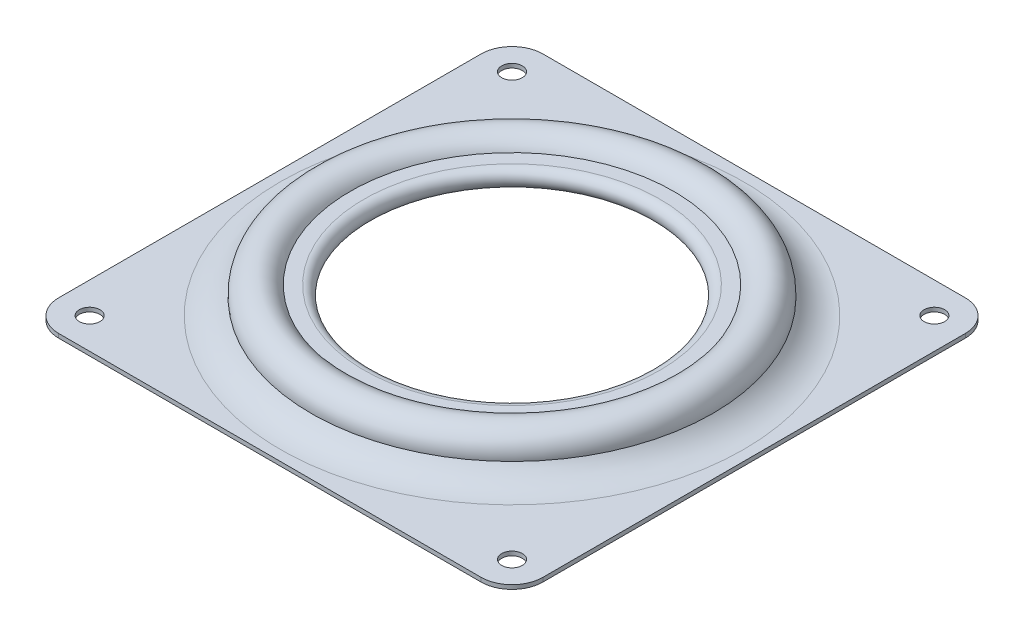
ISO-10303-21;
HEADER;
FILE_DESCRIPTION(('STEP AP214'),'2;1');
FILE_NAME('part.step','',(''),(''),'','','');
FILE_SCHEMA(('AUTOMOTIVE_DESIGN { 1 0 10303 214 1 1 1 1 }'));
ENDSEC;
DATA;
#1=APPLICATION_CONTEXT('core data for automotive mechanical design processes');
#2=APPLICATION_PROTOCOL_DEFINITION('international standard','automotive_design',2000,#1);
#3=PRODUCT_CONTEXT('',#1,'mechanical');
#4=PRODUCT('Part','Part','',(#3));
#5=PRODUCT_RELATED_PRODUCT_CATEGORY('part','',(#4));
#6=PRODUCT_DEFINITION_FORMATION('','',#4);
#7=PRODUCT_DEFINITION_CONTEXT('part definition',#1,'design');
#8=PRODUCT_DEFINITION('design','',#6,#7);
#9=PRODUCT_DEFINITION_SHAPE('','',#8);
#10=(LENGTH_UNIT() NAMED_UNIT(*) SI_UNIT(.MILLI.,.METRE.));
#11=(NAMED_UNIT(*) PLANE_ANGLE_UNIT() SI_UNIT($,.RADIAN.));
#12=(NAMED_UNIT(*) SI_UNIT($,.STERADIAN.) SOLID_ANGLE_UNIT());
#13=UNCERTAINTY_MEASURE_WITH_UNIT(LENGTH_MEASURE(1.E-05),#10,'distance_accuracy_value','');
#14=(GEOMETRIC_REPRESENTATION_CONTEXT(3) GLOBAL_UNCERTAINTY_ASSIGNED_CONTEXT((#13)) GLOBAL_UNIT_ASSIGNED_CONTEXT((#10,
#11,#12)) REPRESENTATION_CONTEXT('',''));
#15=CARTESIAN_POINT('',(0.,0.,0.));
#16=DIRECTION('',(0.,0.,1.));
#17=DIRECTION('',(1.,0.,0.));
#18=AXIS2_PLACEMENT_3D('',#15,#16,#17);
#19=CARTESIAN_POINT('',(-65.,0.,0.));
#20=DIRECTION('',(0.,1.,0.));
#21=DIRECTION('',(-1.,0.,0.));
#22=AXIS2_PLACEMENT_3D('',#19,#20,#21);
#23=PLANE('',#22);
#24=DIRECTION('',(1.,0.,0.));
#25=VECTOR('',#24,1.);
#26=CARTESIAN_POINT('',(-40.9999999999999,0.,47.));
#27=LINE('',#26,#25);
#28=CARTESIAN_POINT('',(-40.9999999999999,0.,47.));
#29=VERTEX_POINT('',#28);
#30=CARTESIAN_POINT('',(40.9999999999999,0.,47.));
#31=VERTEX_POINT('',#30);
#32=EDGE_CURVE('E103',#29,#31,#27,.T.);
#33=ORIENTED_EDGE('',*,*,#32,.F.);
#34=CARTESIAN_POINT('',(-40.9999999999998,0.,40.9999999999999));
#35=DIRECTION('',(0.,1.,0.));
#36=DIRECTION('',(0.,0.,1.));
#37=AXIS2_PLACEMENT_3D('',#34,#35,#36);
#38=CIRCLE('',#37,6.00000000000013);
#39=CARTESIAN_POINT('',(-46.9999999999999,0.,40.9999999999999));
#40=VERTEX_POINT('',#39);
#41=EDGE_CURVE('E111',#40,#29,#38,.T.);
#42=ORIENTED_EDGE('',*,*,#41,.F.);
#43=DIRECTION('',(0.,0.,1.));
#44=VECTOR('',#43,1.);
#45=CARTESIAN_POINT('',(-46.9999999999999,0.,40.9999999999999));
#46=LINE('',#45,#44);
#47=CARTESIAN_POINT('',(-47.,0.,-40.9999999999999));
#48=VERTEX_POINT('',#47);
#49=EDGE_CURVE('E133',#48,#40,#46,.T.);
#50=ORIENTED_EDGE('',*,*,#49,.F.);
#51=CARTESIAN_POINT('',(-40.9999999999999,0.,-40.9999999999999));
#52=DIRECTION('',(0.,1.,0.));
#53=DIRECTION('',(0.,0.,-1.));
#54=AXIS2_PLACEMENT_3D('',#51,#52,#53);
#55=CIRCLE('',#54,6.00000000000009);
#56=CARTESIAN_POINT('',(-40.9999999999999,0.,-47.));
#57=VERTEX_POINT('',#56);
#58=EDGE_CURVE('E47',#57,#48,#55,.T.);
#59=ORIENTED_EDGE('',*,*,#58,.F.);
#60=DIRECTION('',(-1.,0.,0.));
#61=VECTOR('',#60,1.);
#62=CARTESIAN_POINT('',(-40.9999999999999,0.,-47.));
#63=LINE('',#62,#61);
#64=CARTESIAN_POINT('',(40.9999999999999,0.,-47.));
#65=VERTEX_POINT('',#64);
#66=EDGE_CURVE('E129',#65,#57,#63,.T.);
#67=ORIENTED_EDGE('',*,*,#66,.F.);
#68=CARTESIAN_POINT('',(40.9999999999999,0.,-40.9999999999999));
#69=DIRECTION('',(0.,1.,0.));
#70=DIRECTION('',(0.,0.,1.));
#71=AXIS2_PLACEMENT_3D('',#68,#69,#70);
#72=CIRCLE('',#71,6.00000000000009);
#73=CARTESIAN_POINT('',(47.,0.,-40.9999999999999));
#74=VERTEX_POINT('',#73);
#75=EDGE_CURVE('E126',#74,#65,#72,.T.);
#76=ORIENTED_EDGE('',*,*,#75,.F.);
#77=DIRECTION('',(0.,0.,-1.));
#78=VECTOR('',#77,1.);
#79=CARTESIAN_POINT('',(46.9999999999999,0.,40.9999999999998));
#80=LINE('',#79,#78);
#81=CARTESIAN_POINT('',(46.9999999999999,0.,40.9999999999998));
#82=VERTEX_POINT('',#81);
#83=EDGE_CURVE('E121',#82,#74,#80,.T.);
#84=ORIENTED_EDGE('',*,*,#83,.F.);
#85=CARTESIAN_POINT('',(40.9999999999998,0.,40.9999999999999));
#86=DIRECTION('',(0.,1.,0.));
#87=DIRECTION('',(0.,0.,-1.));
#88=AXIS2_PLACEMENT_3D('',#85,#86,#87);
#89=CIRCLE('',#88,6.00000000000013);
#90=EDGE_CURVE('E119',#31,#82,#89,.T.);
#91=ORIENTED_EDGE('',*,*,#90,.F.);
#92=EDGE_LOOP('',(#33,#42,#50,#59,#67,#76,#84,#91));
#93=FACE_BOUND('',#92,.T.);
#94=CARTESIAN_POINT('',(41.,0.,41.));
#95=DIRECTION('',(0.,1.,0.));
#96=DIRECTION('',(0.,0.,1.));
#97=AXIS2_PLACEMENT_3D('',#94,#95,#96);
#98=CIRCLE('',#97,2.);
#99=CARTESIAN_POINT('',(41.,0.,43.));
#100=VERTEX_POINT('',#99);
#101=EDGE_CURVE('E150',#100,#100,#98,.T.);
#102=ORIENTED_EDGE('',*,*,#101,.T.);
#103=EDGE_LOOP('',(#102));
#104=FACE_BOUND('',#103,.T.);
#105=CARTESIAN_POINT('',(-40.9999999999999,0.,-41.));
#106=DIRECTION('',(0.,1.,0.));
#107=DIRECTION('',(0.,0.,1.));
#108=AXIS2_PLACEMENT_3D('',#105,#106,#107);
#109=CIRCLE('',#108,2.);
#110=CARTESIAN_POINT('',(-40.9999999999999,0.,-39.));
#111=VERTEX_POINT('',#110);
#112=EDGE_CURVE('E158',#111,#111,#109,.T.);
#113=ORIENTED_EDGE('',*,*,#112,.T.);
#114=EDGE_LOOP('',(#113));
#115=FACE_BOUND('',#114,.T.);
#116=CARTESIAN_POINT('',(0.,0.,0.));
#117=DIRECTION('',(0.,-1.,0.));
#118=DIRECTION('',(1.,0.,0.));
#119=AXIS2_PLACEMENT_3D('',#116,#117,#118);
#120=CIRCLE('',#119,45.);
#121=CARTESIAN_POINT('',(45.,0.,0.));
#122=VERTEX_POINT('',#121);
#123=EDGE_CURVE('E183',#122,#122,#120,.T.);
#124=ORIENTED_EDGE('',*,*,#123,.F.);
#125=EDGE_LOOP('',(#124));
#126=FACE_BOUND('',#125,.T.);
#127=CARTESIAN_POINT('',(-40.9999999999999,0.,41.));
#128=DIRECTION('',(0.,1.,0.));
#129=DIRECTION('',(0.,0.,-1.));
#130=AXIS2_PLACEMENT_3D('',#127,#128,#129);
#131=CIRCLE('',#130,2.);
#132=CARTESIAN_POINT('',(-40.9999999999999,0.,39.));
#133=VERTEX_POINT('',#132);
#134=EDGE_CURVE('E154',#133,#133,#131,.T.);
#135=ORIENTED_EDGE('',*,*,#134,.T.);
#136=EDGE_LOOP('',(#135));
#137=FACE_BOUND('',#136,.T.);
#138=CARTESIAN_POINT('',(41.,0.,-41.));
#139=DIRECTION('',(0.,1.,0.));
#140=DIRECTION('',(0.,0.,-1.));
#141=AXIS2_PLACEMENT_3D('',#138,#139,#140);
#142=CIRCLE('',#141,2.);
#143=CARTESIAN_POINT('',(41.,0.,-43.));
#144=VERTEX_POINT('',#143);
#145=EDGE_CURVE('E107',#144,#144,#142,.T.);
#146=ORIENTED_EDGE('',*,*,#145,.T.);
#147=EDGE_LOOP('',(#146));
#148=FACE_BOUND('',#147,.T.);
#149=ADVANCED_FACE('F33',(#93,#104,#115,#126,#137,#148),#23,.F.);
#150=CARTESIAN_POINT('',(-65.,0.800000000000001,0.));
#151=DIRECTION('',(0.,-1.,0.));
#152=DIRECTION('',(1.,0.,0.));
#153=AXIS2_PLACEMENT_3D('',#150,#151,#152);
#154=PLANE('',#153);
#155=DIRECTION('',(0.,0.,1.));
#156=VECTOR('',#155,1.);
#157=CARTESIAN_POINT('',(-46.9999999999999,0.800000000000001,0.));
#158=LINE('',#157,#156);
#159=CARTESIAN_POINT('',(-47.,0.8,-40.9999999999999));
#160=VERTEX_POINT('',#159);
#161=CARTESIAN_POINT('',(-46.9999999999999,0.800000000000001,40.9999999999999));
#162=VERTEX_POINT('',#161);
#163=EDGE_CURVE('E186',#160,#162,#158,.T.);
#164=ORIENTED_EDGE('',*,*,#163,.T.);
#165=CARTESIAN_POINT('',(-40.9999999999998,0.8,40.9999999999999));
#166=DIRECTION('',(0.,-1.,0.));
#167=DIRECTION('',(1.,0.,0.));
#168=AXIS2_PLACEMENT_3D('',#165,#166,#167);
#169=CIRCLE('',#168,6.00000000000013);
#170=CARTESIAN_POINT('',(-40.9999999999999,0.8,47.));
#171=VERTEX_POINT('',#170);
#172=EDGE_CURVE('E12',#162,#171,#169,.F.);
#173=ORIENTED_EDGE('',*,*,#172,.T.);
#174=DIRECTION('',(1.,0.,0.));
#175=VECTOR('',#174,1.);
#176=CARTESIAN_POINT('',(-65.,0.800000000000001,47.));
#177=LINE('',#176,#175);
#178=CARTESIAN_POINT('',(40.9999999999999,0.8,47.));
#179=VERTEX_POINT('',#178);
#180=EDGE_CURVE('E40',#171,#179,#177,.T.);
#181=ORIENTED_EDGE('',*,*,#180,.T.);
#182=CARTESIAN_POINT('',(40.9999999999998,0.8,40.9999999999999));
#183=DIRECTION('',(0.,-1.,0.));
#184=DIRECTION('',(1.,0.,0.));
#185=AXIS2_PLACEMENT_3D('',#182,#183,#184);
#186=CIRCLE('',#185,6.00000000000013);
#187=CARTESIAN_POINT('',(46.9999999999999,0.8,40.9999999999998));
#188=VERTEX_POINT('',#187);
#189=EDGE_CURVE('E209',#179,#188,#186,.F.);
#190=ORIENTED_EDGE('',*,*,#189,.T.);
#191=DIRECTION('',(0.,0.,-1.));
#192=VECTOR('',#191,1.);
#193=CARTESIAN_POINT('',(46.9999999999999,0.800000000000001,0.));
#194=LINE('',#193,#192);
#195=CARTESIAN_POINT('',(47.,0.8,-40.9999999999999));
#196=VERTEX_POINT('',#195);
#197=EDGE_CURVE('E206',#188,#196,#194,.T.);
#198=ORIENTED_EDGE('',*,*,#197,.T.);
#199=CARTESIAN_POINT('',(40.9999999999999,0.8,-40.9999999999999));
#200=DIRECTION('',(0.,-1.,0.));
#201=DIRECTION('',(1.,0.,0.));
#202=AXIS2_PLACEMENT_3D('',#199,#200,#201);
#203=CIRCLE('',#202,6.00000000000009);
#204=CARTESIAN_POINT('',(40.9999999999999,0.8,-47.));
#205=VERTEX_POINT('',#204);
#206=EDGE_CURVE('E203',#196,#205,#203,.F.);
#207=ORIENTED_EDGE('',*,*,#206,.T.);
#208=DIRECTION('',(-1.,0.,0.));
#209=VECTOR('',#208,1.);
#210=CARTESIAN_POINT('',(-65.,0.800000000000001,-47.));
#211=LINE('',#210,#209);
#212=CARTESIAN_POINT('',(-40.9999999999999,0.8,-47.));
#213=VERTEX_POINT('',#212);
#214=EDGE_CURVE('E200',#205,#213,#211,.T.);
#215=ORIENTED_EDGE('',*,*,#214,.T.);
#216=CARTESIAN_POINT('',(-40.9999999999999,0.8,-40.9999999999999));
#217=DIRECTION('',(0.,-1.,0.));
#218=DIRECTION('',(1.,0.,0.));
#219=AXIS2_PLACEMENT_3D('',#216,#217,#218);
#220=CIRCLE('',#219,6.00000000000009);
#221=EDGE_CURVE('E197',#213,#160,#220,.F.);
#222=ORIENTED_EDGE('',*,*,#221,.T.);
#223=EDGE_LOOP('',(#164,#173,#181,#190,#198,#207,#215,#222));
#224=FACE_BOUND('',#223,.T.);
#225=CARTESIAN_POINT('',(41.,0.8,41.));
#226=DIRECTION('',(0.,-1.,0.));
#227=DIRECTION('',(1.,0.,0.));
#228=AXIS2_PLACEMENT_3D('',#225,#226,#227);
#229=CIRCLE('',#228,2.);
#230=CARTESIAN_POINT('',(43.,0.8,41.));
#231=VERTEX_POINT('',#230);
#232=EDGE_CURVE('E153',#231,#231,#229,.F.);
#233=ORIENTED_EDGE('',*,*,#232,.F.);
#234=EDGE_LOOP('',(#233));
#235=FACE_BOUND('',#234,.T.);
#236=CARTESIAN_POINT('',(-40.9999999999999,0.8,-41.));
#237=DIRECTION('',(0.,-1.,0.));
#238=DIRECTION('',(1.,0.,0.));
#239=AXIS2_PLACEMENT_3D('',#236,#237,#238);
#240=CIRCLE('',#239,2.);
#241=CARTESIAN_POINT('',(-38.9999999999999,0.8,-41.));
#242=VERTEX_POINT('',#241);
#243=EDGE_CURVE('E161',#242,#242,#240,.F.);
#244=ORIENTED_EDGE('',*,*,#243,.F.);
#245=EDGE_LOOP('',(#244));
#246=FACE_BOUND('',#245,.T.);
#247=CARTESIAN_POINT('',(0.,0.800000000000002,0.));
#248=DIRECTION('',(0.,-1.,0.));
#249=DIRECTION('',(1.,0.,0.));
#250=AXIS2_PLACEMENT_3D('',#247,#248,#249);
#251=CIRCLE('',#250,45.);
#252=CARTESIAN_POINT('',(45.,0.800000000000002,0.));
#253=VERTEX_POINT('',#252);
#254=EDGE_CURVE('E162',#253,#253,#251,.T.);
#255=ORIENTED_EDGE('',*,*,#254,.T.);
#256=EDGE_LOOP('',(#255));
#257=FACE_BOUND('',#256,.T.);
#258=CARTESIAN_POINT('',(-40.9999999999999,0.8,41.));
#259=DIRECTION('',(0.,-1.,0.));
#260=DIRECTION('',(1.,0.,0.));
#261=AXIS2_PLACEMENT_3D('',#258,#259,#260);
#262=CIRCLE('',#261,2.);
#263=CARTESIAN_POINT('',(-38.9999999999999,0.8,41.));
#264=VERTEX_POINT('',#263);
#265=EDGE_CURVE('E157',#264,#264,#262,.F.);
#266=ORIENTED_EDGE('',*,*,#265,.F.);
#267=EDGE_LOOP('',(#266));
#268=FACE_BOUND('',#267,.T.);
#269=CARTESIAN_POINT('',(41.,0.8,-41.));
#270=DIRECTION('',(0.,-1.,0.));
#271=DIRECTION('',(1.,0.,0.));
#272=AXIS2_PLACEMENT_3D('',#269,#270,#271);
#273=CIRCLE('',#272,2.);
#274=CARTESIAN_POINT('',(43.,0.8,-41.));
#275=VERTEX_POINT('',#274);
#276=EDGE_CURVE('E149',#275,#275,#273,.F.);
#277=ORIENTED_EDGE('',*,*,#276,.F.);
#278=EDGE_LOOP('',(#277));
#279=FACE_BOUND('',#278,.T.);
#280=ADVANCED_FACE('F212',(#224,#235,#246,#257,#268,#279),#154,.F.);
#281=CARTESIAN_POINT('',(0.,15.,0.));
#282=DIRECTION('',(0.,-1.,0.));
#283=DIRECTION('',(1.,0.,0.));
#284=AXIS2_PLACEMENT_3D('',#281,#282,#283);
#285=TOROIDAL_SURFACE('',#284,45.,15.);
#286=CARTESIAN_POINT('',(0.,1.69347428902901,0.));
#287=DIRECTION('',(0.,-1.,0.));
#288=DIRECTION('',(1.,0.,0.));
#289=AXIS2_PLACEMENT_3D('',#286,#287,#288);
#290=CIRCLE('',#289,38.0763901392938);
#291=CARTESIAN_POINT('',(38.0763901392938,1.69347428902901,0.));
#292=VERTEX_POINT('',#291);
#293=EDGE_CURVE('E180',#292,#292,#290,.T.);
#294=ORIENTED_EDGE('',*,*,#293,.F.);
#295=EDGE_LOOP('',(#294));
#296=FACE_BOUND('',#295,.T.);
#297=ORIENTED_EDGE('',*,*,#123,.T.);
#298=EDGE_LOOP('',(#297));
#299=FACE_BOUND('',#298,.T.);
#300=ADVANCED_FACE('F242',(#296,#299),#285,.T.);
#301=CARTESIAN_POINT('',(0.,4.25,0.));
#302=DIRECTION('',(0.,-1.,0.));
#303=DIRECTION('',(1.,0.,0.));
#304=AXIS2_PLACEMENT_3D('',#301,#302,#303);
#305=TOROIDAL_SURFACE('',#304,35.,4.);
#306=CARTESIAN_POINT('',(0.,2.5,0.));
#307=DIRECTION('',(0.,-1.,0.));
#308=DIRECTION('',(1.,0.,0.));
#309=AXIS2_PLACEMENT_3D('',#306,#307,#308);
#310=CIRCLE('',#309,31.4031263575155);
#311=CARTESIAN_POINT('',(31.4031263575155,2.5,0.));
#312=VERTEX_POINT('',#311);
#313=EDGE_CURVE('E177',#312,#312,#310,.T.);
#314=ORIENTED_EDGE('',*,*,#313,.F.);
#315=EDGE_LOOP('',(#314));
#316=FACE_BOUND('',#315,.T.);
#317=ORIENTED_EDGE('',*,*,#293,.T.);
#318=EDGE_LOOP('',(#317));
#319=FACE_BOUND('',#318,.T.);
#320=ADVANCED_FACE('F247',(#316,#319),#305,.T.);
#321=CARTESIAN_POINT('',(-31.4031263575155,2.5,0.));
#322=DIRECTION('',(0.,1.,0.));
#323=DIRECTION('',(-1.,0.,0.));
#324=AXIS2_PLACEMENT_3D('',#321,#322,#323);
#325=PLANE('',#324);
#326=CARTESIAN_POINT('',(0.,2.5,0.));
#327=DIRECTION('',(0.,-1.,0.));
#328=DIRECTION('',(1.,0.,0.));
#329=AXIS2_PLACEMENT_3D('',#326,#327,#328);
#330=CIRCLE('',#329,28.75);
#331=CARTESIAN_POINT('',(28.75,2.5,0.));
#332=VERTEX_POINT('',#331);
#333=EDGE_CURVE('E174',#332,#332,#330,.T.);
#334=ORIENTED_EDGE('',*,*,#333,.F.);
#335=EDGE_LOOP('',(#334));
#336=FACE_BOUND('',#335,.T.);
#337=ORIENTED_EDGE('',*,*,#313,.T.);
#338=EDGE_LOOP('',(#337));
#339=FACE_BOUND('',#338,.T.);
#340=ADVANCED_FACE('F268',(#336,#339),#325,.F.);
#341=CARTESIAN_POINT('',(0.,4.25,0.));
#342=DIRECTION('',(0.,-1.,0.));
#343=DIRECTION('',(1.,0.,0.));
#344=AXIS2_PLACEMENT_3D('',#341,#342,#343);
#345=TOROIDAL_SURFACE('',#344,28.75,1.75);
#346=CARTESIAN_POINT('',(0.,6.,0.));
#347=DIRECTION('',(0.,-1.,0.));
#348=DIRECTION('',(1.,0.,0.));
#349=AXIS2_PLACEMENT_3D('',#346,#347,#348);
#350=CIRCLE('',#349,28.75);
#351=CARTESIAN_POINT('',(28.75,6.,0.));
#352=VERTEX_POINT('',#351);
#353=EDGE_CURVE('E171',#352,#352,#350,.T.);
#354=ORIENTED_EDGE('',*,*,#353,.F.);
#355=EDGE_LOOP('',(#354));
#356=FACE_BOUND('',#355,.T.);
#357=ORIENTED_EDGE('',*,*,#333,.T.);
#358=EDGE_LOOP('',(#357));
#359=FACE_BOUND('',#358,.T.);
#360=ADVANCED_FACE('F264',(#356,#359),#345,.T.);
#361=CARTESIAN_POINT('',(-28.75,6.,0.));
#362=DIRECTION('',(0.,-1.,0.));
#363=DIRECTION('',(1.,0.,0.));
#364=AXIS2_PLACEMENT_3D('',#361,#362,#363);
#365=PLANE('',#364);
#366=CARTESIAN_POINT('',(0.,6.,0.));
#367=DIRECTION('',(0.,-1.,0.));
#368=DIRECTION('',(1.,0.,0.));
#369=AXIS2_PLACEMENT_3D('',#366,#367,#368);
#370=CIRCLE('',#369,31.4031263575155);
#371=CARTESIAN_POINT('',(31.4031263575155,6.,0.));
#372=VERTEX_POINT('',#371);
#373=EDGE_CURVE('E168',#372,#372,#370,.T.);
#374=ORIENTED_EDGE('',*,*,#373,.F.);
#375=EDGE_LOOP('',(#374));
#376=FACE_BOUND('',#375,.T.);
#377=ORIENTED_EDGE('',*,*,#353,.T.);
#378=EDGE_LOOP('',(#377));
#379=FACE_BOUND('',#378,.T.);
#380=ADVANCED_FACE('F260',(#376,#379),#365,.F.);
#381=CARTESIAN_POINT('',(0.,4.25,0.));
#382=DIRECTION('',(0.,-1.,0.));
#383=DIRECTION('',(1.,0.,0.));
#384=AXIS2_PLACEMENT_3D('',#381,#382,#383);
#385=TOROIDAL_SURFACE('',#384,35.,4.);
#386=CARTESIAN_POINT('',(0.,3.82967904525176,0.));
#387=DIRECTION('',(0.,-1.,0.));
#388=DIRECTION('',(1.,0.,0.));
#389=AXIS2_PLACEMENT_3D('',#386,#387,#388);
#390=CIRCLE('',#389,38.977854986673);
#391=CARTESIAN_POINT('',(38.977854986673,3.82967904525176,0.));
#392=VERTEX_POINT('',#391);
#393=EDGE_CURVE('E165',#392,#392,#390,.T.);
#394=ORIENTED_EDGE('',*,*,#393,.F.);
#395=EDGE_LOOP('',(#394));
#396=FACE_BOUND('',#395,.T.);
#397=ORIENTED_EDGE('',*,*,#373,.T.);
#398=EDGE_LOOP('',(#397));
#399=FACE_BOUND('',#398,.T.);
#400=ADVANCED_FACE('F256',(#396,#399),#385,.T.);
#401=CARTESIAN_POINT('',(0.,8.3,0.));
#402=DIRECTION('',(0.,-1.,0.));
#403=DIRECTION('',(1.,0.,0.));
#404=AXIS2_PLACEMENT_3D('',#401,#402,#403);
#405=TOROIDAL_SURFACE('',#404,45.,7.5);
#406=ORIENTED_EDGE('',*,*,#254,.F.);
#407=EDGE_LOOP('',(#406));
#408=FACE_BOUND('',#407,.T.);
#409=ORIENTED_EDGE('',*,*,#393,.T.);
#410=EDGE_LOOP('',(#409));
#411=FACE_BOUND('',#410,.T.);
#412=ADVANCED_FACE('F253',(#408,#411),#405,.F.);
#413=CARTESIAN_POINT('',(-40.9999999999999,10.,-41.));
#414=DIRECTION('',(0.,-1.,0.));
#415=DIRECTION('',(0.,0.,-1.));
#416=AXIS2_PLACEMENT_3D('',#413,#414,#415);
#417=CYLINDRICAL_SURFACE('',#416,2.);
#418=ORIENTED_EDGE('',*,*,#112,.F.);
#419=EDGE_LOOP('',(#418));
#420=FACE_BOUND('',#419,.T.);
#421=ORIENTED_EDGE('',*,*,#243,.T.);
#422=EDGE_LOOP('',(#421));
#423=FACE_BOUND('',#422,.T.);
#424=ADVANCED_FACE('F251',(#420,#423),#417,.F.);
#425=CARTESIAN_POINT('',(-40.9999999999999,10.,41.));
#426=DIRECTION('',(0.,-1.,0.));
#427=DIRECTION('',(0.,0.,-1.));
#428=AXIS2_PLACEMENT_3D('',#425,#426,#427);
#429=CYLINDRICAL_SURFACE('',#428,2.);
#430=ORIENTED_EDGE('',*,*,#134,.F.);
#431=EDGE_LOOP('',(#430));
#432=FACE_BOUND('',#431,.T.);
#433=ORIENTED_EDGE('',*,*,#265,.T.);
#434=EDGE_LOOP('',(#433));
#435=FACE_BOUND('',#434,.T.);
#436=ADVANCED_FACE('F300',(#432,#435),#429,.F.);
#437=CARTESIAN_POINT('',(41.,10.,41.));
#438=DIRECTION('',(0.,-1.,0.));
#439=DIRECTION('',(0.,0.,-1.));
#440=AXIS2_PLACEMENT_3D('',#437,#438,#439);
#441=CYLINDRICAL_SURFACE('',#440,2.);
#442=ORIENTED_EDGE('',*,*,#101,.F.);
#443=EDGE_LOOP('',(#442));
#444=FACE_BOUND('',#443,.T.);
#445=ORIENTED_EDGE('',*,*,#232,.T.);
#446=EDGE_LOOP('',(#445));
#447=FACE_BOUND('',#446,.T.);
#448=ADVANCED_FACE('F291',(#444,#447),#441,.F.);
#449=CARTESIAN_POINT('',(41.,10.,-41.));
#450=DIRECTION('',(0.,-1.,0.));
#451=DIRECTION('',(0.,0.,-1.));
#452=AXIS2_PLACEMENT_3D('',#449,#450,#451);
#453=CYLINDRICAL_SURFACE('',#452,2.);
#454=ORIENTED_EDGE('',*,*,#145,.F.);
#455=EDGE_LOOP('',(#454));
#456=FACE_BOUND('',#455,.T.);
#457=ORIENTED_EDGE('',*,*,#276,.T.);
#458=EDGE_LOOP('',(#457));
#459=FACE_BOUND('',#458,.T.);
#460=ADVANCED_FACE('F288',(#456,#459),#453,.F.);
#461=CARTESIAN_POINT('',(-40.9999999999998,10.,40.9999999999999));
#462=DIRECTION('',(0.,-1.,0.));
#463=DIRECTION('',(0.,0.,-1.));
#464=AXIS2_PLACEMENT_3D('',#461,#462,#463);
#465=CYLINDRICAL_SURFACE('',#464,6.00000000000013);
#466=DIRECTION('',(0.,-1.,0.));
#467=VECTOR('',#466,1.);
#468=CARTESIAN_POINT('',(-46.9999999999999,10.,40.9999999999999));
#469=LINE('',#468,#467);
#470=EDGE_CURVE('E55',#162,#40,#469,.T.);
#471=ORIENTED_EDGE('',*,*,#470,.T.);
#472=ORIENTED_EDGE('',*,*,#41,.T.);
#473=DIRECTION('',(0.,-1.,0.));
#474=VECTOR('',#473,1.);
#475=CARTESIAN_POINT('',(-40.9999999999999,10.,47.));
#476=LINE('',#475,#474);
#477=EDGE_CURVE('E98',#171,#29,#476,.T.);
#478=ORIENTED_EDGE('',*,*,#477,.F.);
#479=ORIENTED_EDGE('',*,*,#172,.F.);
#480=EDGE_LOOP('',(#471,#472,#478,#479));
#481=FACE_BOUND('',#480,.T.);
#482=ADVANCED_FACE('F112',(#481),#465,.T.);
#483=CARTESIAN_POINT('',(-40.9999999999999,10.,47.));
#484=DIRECTION('',(0.,0.,-1.));
#485=DIRECTION('',(-1.,0.,0.));
#486=AXIS2_PLACEMENT_3D('',#483,#484,#485);
#487=PLANE('',#486);
#488=ORIENTED_EDGE('',*,*,#477,.T.);
#489=ORIENTED_EDGE('',*,*,#32,.T.);
#490=DIRECTION('',(0.,-1.,0.));
#491=VECTOR('',#490,1.);
#492=CARTESIAN_POINT('',(40.9999999999999,10.,47.));
#493=LINE('',#492,#491);
#494=EDGE_CURVE('E108',#179,#31,#493,.T.);
#495=ORIENTED_EDGE('',*,*,#494,.F.);
#496=ORIENTED_EDGE('',*,*,#180,.F.);
#497=EDGE_LOOP('',(#488,#489,#495,#496));
#498=FACE_BOUND('',#497,.T.);
#499=ADVANCED_FACE('F100',(#498),#487,.F.);
#500=CARTESIAN_POINT('',(40.9999999999998,10.,40.9999999999999));
#501=DIRECTION('',(0.,-1.,0.));
#502=DIRECTION('',(0.,0.,-1.));
#503=AXIS2_PLACEMENT_3D('',#500,#501,#502);
#504=CYLINDRICAL_SURFACE('',#503,6.00000000000013);
#505=ORIENTED_EDGE('',*,*,#494,.T.);
#506=ORIENTED_EDGE('',*,*,#90,.T.);
#507=DIRECTION('',(0.,-1.,0.));
#508=VECTOR('',#507,1.);
#509=CARTESIAN_POINT('',(46.9999999999999,10.,40.9999999999998));
#510=LINE('',#509,#508);
#511=EDGE_CURVE('E144',#188,#82,#510,.T.);
#512=ORIENTED_EDGE('',*,*,#511,.F.);
#513=ORIENTED_EDGE('',*,*,#189,.F.);
#514=EDGE_LOOP('',(#505,#506,#512,#513));
#515=FACE_BOUND('',#514,.T.);
#516=ADVANCED_FACE('F229',(#515),#504,.T.);
#517=CARTESIAN_POINT('',(46.9999999999999,10.,40.9999999999998));
#518=DIRECTION('',(-1.,0.,0.));
#519=DIRECTION('',(0.,0.,1.));
#520=AXIS2_PLACEMENT_3D('',#517,#518,#519);
#521=PLANE('',#520);
#522=ORIENTED_EDGE('',*,*,#511,.T.);
#523=ORIENTED_EDGE('',*,*,#83,.T.);
#524=DIRECTION('',(0.,-1.,0.));
#525=VECTOR('',#524,1.);
#526=CARTESIAN_POINT('',(47.,10.,-40.9999999999999));
#527=LINE('',#526,#525);
#528=EDGE_CURVE('E142',#196,#74,#527,.T.);
#529=ORIENTED_EDGE('',*,*,#528,.F.);
#530=ORIENTED_EDGE('',*,*,#197,.F.);
#531=EDGE_LOOP('',(#522,#523,#529,#530));
#532=FACE_BOUND('',#531,.T.);
#533=ADVANCED_FACE('F225',(#532),#521,.F.);
#534=CARTESIAN_POINT('',(40.9999999999999,10.,-40.9999999999999));
#535=DIRECTION('',(0.,-1.,0.));
#536=DIRECTION('',(0.,0.,-1.));
#537=AXIS2_PLACEMENT_3D('',#534,#535,#536);
#538=CYLINDRICAL_SURFACE('',#537,6.00000000000009);
#539=ORIENTED_EDGE('',*,*,#528,.T.);
#540=ORIENTED_EDGE('',*,*,#75,.T.);
#541=DIRECTION('',(0.,-1.,0.));
#542=VECTOR('',#541,1.);
#543=CARTESIAN_POINT('',(40.9999999999999,10.,-47.));
#544=LINE('',#543,#542);
#545=EDGE_CURVE('E140',#205,#65,#544,.T.);
#546=ORIENTED_EDGE('',*,*,#545,.F.);
#547=ORIENTED_EDGE('',*,*,#206,.F.);
#548=EDGE_LOOP('',(#539,#540,#546,#547));
#549=FACE_BOUND('',#548,.T.);
#550=ADVANCED_FACE('F223',(#549),#538,.T.);
#551=CARTESIAN_POINT('',(-40.9999999999999,10.,-47.));
#552=DIRECTION('',(0.,0.,1.));
#553=DIRECTION('',(1.,0.,0.));
#554=AXIS2_PLACEMENT_3D('',#551,#552,#553);
#555=PLANE('',#554);
#556=ORIENTED_EDGE('',*,*,#545,.T.);
#557=ORIENTED_EDGE('',*,*,#66,.T.);
#558=DIRECTION('',(0.,-1.,0.));
#559=VECTOR('',#558,1.);
#560=CARTESIAN_POINT('',(-40.9999999999999,10.,-47.));
#561=LINE('',#560,#559);
#562=EDGE_CURVE('E138',#213,#57,#561,.T.);
#563=ORIENTED_EDGE('',*,*,#562,.F.);
#564=ORIENTED_EDGE('',*,*,#214,.F.);
#565=EDGE_LOOP('',(#556,#557,#563,#564));
#566=FACE_BOUND('',#565,.T.);
#567=ADVANCED_FACE('F218',(#566),#555,.F.);
#568=CARTESIAN_POINT('',(-40.9999999999999,10.,-40.9999999999999));
#569=DIRECTION('',(0.,-1.,0.));
#570=DIRECTION('',(0.,0.,-1.));
#571=AXIS2_PLACEMENT_3D('',#568,#569,#570);
#572=CYLINDRICAL_SURFACE('',#571,6.00000000000009);
#573=ORIENTED_EDGE('',*,*,#562,.T.);
#574=ORIENTED_EDGE('',*,*,#58,.T.);
#575=DIRECTION('',(0.,-1.,0.));
#576=VECTOR('',#575,1.);
#577=CARTESIAN_POINT('',(-47.,10.,-40.9999999999999));
#578=LINE('',#577,#576);
#579=EDGE_CURVE('E136',#160,#48,#578,.T.);
#580=ORIENTED_EDGE('',*,*,#579,.F.);
#581=ORIENTED_EDGE('',*,*,#221,.F.);
#582=EDGE_LOOP('',(#573,#574,#580,#581));
#583=FACE_BOUND('',#582,.T.);
#584=ADVANCED_FACE('F215',(#583),#572,.T.);
#585=CARTESIAN_POINT('',(-46.9999999999999,10.,40.9999999999999));
#586=DIRECTION('',(1.,0.,0.));
#587=DIRECTION('',(0.,0.,-1.));
#588=AXIS2_PLACEMENT_3D('',#585,#586,#587);
#589=PLANE('',#588);
#590=ORIENTED_EDGE('',*,*,#579,.T.);
#591=ORIENTED_EDGE('',*,*,#49,.T.);
#592=ORIENTED_EDGE('',*,*,#470,.F.);
#593=ORIENTED_EDGE('',*,*,#163,.F.);
#594=EDGE_LOOP('',(#590,#591,#592,#593));
#595=FACE_BOUND('',#594,.T.);
#596=ADVANCED_FACE('F214',(#595),#589,.F.);
#597=CLOSED_SHELL('',(#149,#280,#300,#320,#340,#360,#380,#400,#412,#424,#436,#448,#460,#482,
#499,#516,#533,#550,#567,#584,#596));
#598=MANIFOLD_SOLID_BREP('B2',#597);
#599=ADVANCED_BREP_SHAPE_REPRESENTATION('',(#18,#598),#14);
#600=SHAPE_DEFINITION_REPRESENTATION(#9,#599);
ENDSEC;
END-ISO-10303-21;
